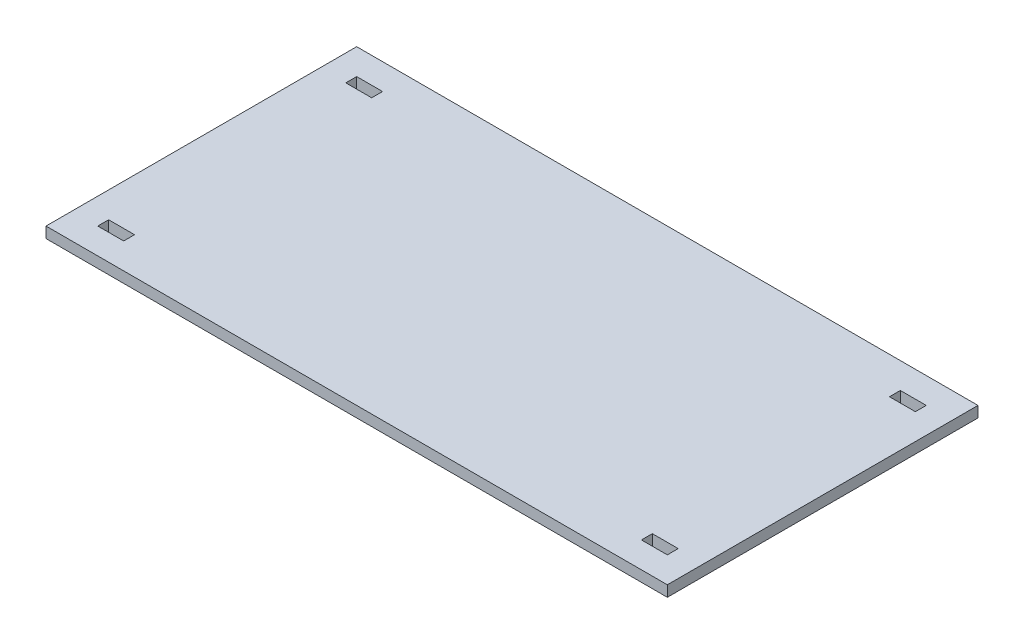
ISO-10303-21;
HEADER;
FILE_DESCRIPTION(('STEP AP214'),'2;1');
FILE_NAME('part.step','',(''),(''),'','','');
FILE_SCHEMA(('AUTOMOTIVE_DESIGN { 1 0 10303 214 1 1 1 1 }'));
ENDSEC;
DATA;
#1=APPLICATION_CONTEXT('core data for automotive mechanical design processes');
#2=APPLICATION_PROTOCOL_DEFINITION('international standard','automotive_design',2000,#1);
#3=PRODUCT_CONTEXT('',#1,'mechanical');
#4=PRODUCT('Part','Part','',(#3));
#5=PRODUCT_RELATED_PRODUCT_CATEGORY('part','',(#4));
#6=PRODUCT_DEFINITION_FORMATION('','',#4);
#7=PRODUCT_DEFINITION_CONTEXT('part definition',#1,'design');
#8=PRODUCT_DEFINITION('design','',#6,#7);
#9=PRODUCT_DEFINITION_SHAPE('','',#8);
#10=(LENGTH_UNIT() NAMED_UNIT(*) SI_UNIT(.MILLI.,.METRE.));
#11=(NAMED_UNIT(*) PLANE_ANGLE_UNIT() SI_UNIT($,.RADIAN.));
#12=(NAMED_UNIT(*) SI_UNIT($,.STERADIAN.) SOLID_ANGLE_UNIT());
#13=UNCERTAINTY_MEASURE_WITH_UNIT(LENGTH_MEASURE(1.E-05),#10,'distance_accuracy_value','');
#14=(GEOMETRIC_REPRESENTATION_CONTEXT(3) GLOBAL_UNCERTAINTY_ASSIGNED_CONTEXT((#13)) GLOBAL_UNIT_ASSIGNED_CONTEXT((#10,
#11,#12)) REPRESENTATION_CONTEXT('',''));
#15=CARTESIAN_POINT('',(0.,0.,0.));
#16=DIRECTION('',(0.,0.,1.));
#17=DIRECTION('',(1.,0.,0.));
#18=AXIS2_PLACEMENT_3D('',#15,#16,#17);
#19=CARTESIAN_POINT('',(-216.154910022963,5.334,-23.7753050079687));
#20=DIRECTION('',(1.,0.,0.));
#21=DIRECTION('',(0.,0.,-1.));
#22=AXIS2_PLACEMENT_3D('',#19,#20,#21);
#23=PLANE('',#22);
#24=DIRECTION('',(0.,0.,1.));
#25=VECTOR('',#24,1.);
#26=CARTESIAN_POINT('',(-216.154910022963,0.,-23.7753050079687));
#27=LINE('',#26,#25);
#28=CARTESIAN_POINT('',(-216.154910022963,0.,-23.7753050079687));
#29=VERTEX_POINT('',#28);
#30=CARTESIAN_POINT('',(-216.154910022963,0.,128.624694992031));
#31=VERTEX_POINT('',#30);
#32=EDGE_CURVE('E298',#29,#31,#27,.T.);
#33=ORIENTED_EDGE('',*,*,#32,.T.);
#34=DIRECTION('',(0.,-1.,0.));
#35=VECTOR('',#34,1.);
#36=CARTESIAN_POINT('',(-216.154910022963,5.334,128.624694992031));
#37=LINE('',#36,#35);
#38=CARTESIAN_POINT('',(-216.154910022963,5.334,128.624694992031));
#39=VERTEX_POINT('',#38);
#40=EDGE_CURVE('E11',#39,#31,#37,.T.);
#41=ORIENTED_EDGE('',*,*,#40,.F.);
#42=DIRECTION('',(0.,0.,1.));
#43=VECTOR('',#42,1.);
#44=CARTESIAN_POINT('',(-216.154910022963,5.334,-23.7753050079687));
#45=LINE('',#44,#43);
#46=CARTESIAN_POINT('',(-216.154910022963,5.334,-23.7753050079687));
#47=VERTEX_POINT('',#46);
#48=EDGE_CURVE('E305',#47,#39,#45,.T.);
#49=ORIENTED_EDGE('',*,*,#48,.F.);
#50=DIRECTION('',(0.,-1.,0.));
#51=VECTOR('',#50,1.);
#52=CARTESIAN_POINT('',(-216.154910022963,5.334,-23.7753050079687));
#53=LINE('',#52,#51);
#54=EDGE_CURVE('E315',#47,#29,#53,.T.);
#55=ORIENTED_EDGE('',*,*,#54,.T.);
#56=EDGE_LOOP('',(#33,#41,#49,#55));
#57=FACE_BOUND('',#56,.T.);
#58=ADVANCED_FACE('F33',(#57),#23,.F.);
#59=CARTESIAN_POINT('',(-216.154910022963,5.334,128.624694992031));
#60=DIRECTION('',(0.,0.,-1.));
#61=DIRECTION('',(-1.,0.,0.));
#62=AXIS2_PLACEMENT_3D('',#59,#60,#61);
#63=PLANE('',#62);
#64=DIRECTION('',(1.,0.,0.));
#65=VECTOR('',#64,1.);
#66=CARTESIAN_POINT('',(-216.154910022963,0.,128.624694992031));
#67=LINE('',#66,#65);
#68=CARTESIAN_POINT('',(88.6450899770369,0.,128.624694992031));
#69=VERTEX_POINT('',#68);
#70=EDGE_CURVE('E318',#31,#69,#67,.T.);
#71=ORIENTED_EDGE('',*,*,#70,.T.);
#72=DIRECTION('',(0.,-1.,0.));
#73=VECTOR('',#72,1.);
#74=CARTESIAN_POINT('',(88.6450899770369,5.334,128.624694992031));
#75=LINE('',#74,#73);
#76=CARTESIAN_POINT('',(88.6450899770369,5.334,128.624694992031));
#77=VERTEX_POINT('',#76);
#78=EDGE_CURVE('E40',#77,#69,#75,.T.);
#79=ORIENTED_EDGE('',*,*,#78,.F.);
#80=DIRECTION('',(1.,0.,0.));
#81=VECTOR('',#80,1.);
#82=CARTESIAN_POINT('',(-216.154910022963,5.334,128.624694992031));
#83=LINE('',#82,#81);
#84=EDGE_CURVE('E308',#39,#77,#83,.T.);
#85=ORIENTED_EDGE('',*,*,#84,.F.);
#86=ORIENTED_EDGE('',*,*,#40,.T.);
#87=EDGE_LOOP('',(#71,#79,#85,#86));
#88=FACE_BOUND('',#87,.T.);
#89=ADVANCED_FACE('F347',(#88),#63,.F.);
#90=CARTESIAN_POINT('',(88.6450899770369,5.334,-23.7753050079687));
#91=DIRECTION('',(-1.,0.,0.));
#92=DIRECTION('',(0.,0.,1.));
#93=AXIS2_PLACEMENT_3D('',#90,#91,#92);
#94=PLANE('',#93);
#95=DIRECTION('',(0.,0.,-1.));
#96=VECTOR('',#95,1.);
#97=CARTESIAN_POINT('',(88.6450899770369,0.,-23.7753050079687));
#98=LINE('',#97,#96);
#99=CARTESIAN_POINT('',(88.6450899770369,0.,-23.7753050079687));
#100=VERTEX_POINT('',#99);
#101=EDGE_CURVE('E320',#69,#100,#98,.T.);
#102=ORIENTED_EDGE('',*,*,#101,.T.);
#103=DIRECTION('',(0.,-1.,0.));
#104=VECTOR('',#103,1.);
#105=CARTESIAN_POINT('',(88.6450899770369,5.334,-23.7753050079687));
#106=LINE('',#105,#104);
#107=CARTESIAN_POINT('',(88.6450899770369,5.334,-23.7753050079687));
#108=VERTEX_POINT('',#107);
#109=EDGE_CURVE('E325',#108,#100,#106,.T.);
#110=ORIENTED_EDGE('',*,*,#109,.F.);
#111=DIRECTION('',(0.,0.,-1.));
#112=VECTOR('',#111,1.);
#113=CARTESIAN_POINT('',(88.6450899770369,5.334,-23.7753050079687));
#114=LINE('',#113,#112);
#115=EDGE_CURVE('E311',#77,#108,#114,.T.);
#116=ORIENTED_EDGE('',*,*,#115,.F.);
#117=ORIENTED_EDGE('',*,*,#78,.T.);
#118=EDGE_LOOP('',(#102,#110,#116,#117));
#119=FACE_BOUND('',#118,.T.);
#120=ADVANCED_FACE('F332',(#119),#94,.F.);
#121=CARTESIAN_POINT('',(-216.154910022963,5.334,-23.7753050079687));
#122=DIRECTION('',(0.,0.,1.));
#123=DIRECTION('',(1.,0.,0.));
#124=AXIS2_PLACEMENT_3D('',#121,#122,#123);
#125=PLANE('',#124);
#126=DIRECTION('',(-1.,0.,0.));
#127=VECTOR('',#126,1.);
#128=CARTESIAN_POINT('',(-216.154910022963,0.,-23.7753050079687));
#129=LINE('',#128,#127);
#130=EDGE_CURVE('E309',#100,#29,#129,.T.);
#131=ORIENTED_EDGE('',*,*,#130,.T.);
#132=ORIENTED_EDGE('',*,*,#54,.F.);
#133=DIRECTION('',(-1.,0.,0.));
#134=VECTOR('',#133,1.);
#135=CARTESIAN_POINT('',(-216.154910022963,5.334,-23.7753050079687));
#136=LINE('',#135,#134);
#137=EDGE_CURVE('E313',#108,#47,#136,.T.);
#138=ORIENTED_EDGE('',*,*,#137,.F.);
#139=ORIENTED_EDGE('',*,*,#109,.T.);
#140=EDGE_LOOP('',(#131,#132,#138,#139));
#141=FACE_BOUND('',#140,.T.);
#142=ADVANCED_FACE('F340',(#141),#125,.F.);
#143=CARTESIAN_POINT('',(0.,5.334,0.));
#144=DIRECTION('',(0.,1.,0.));
#145=DIRECTION('',(0.,0.,1.));
#146=AXIS2_PLACEMENT_3D('',#143,#144,#145);
#147=PLANE('',#146);
#148=DIRECTION('',(-1.,0.,0.));
#149=VECTOR('',#148,1.);
#150=CARTESIAN_POINT('',(-190.754910022963,5.334,110.590694992031));
#151=LINE('',#150,#149);
#152=CARTESIAN_POINT('',(-190.754910022963,5.334,110.590694992031));
#153=VERTEX_POINT('',#152);
#154=CARTESIAN_POINT('',(-203.454910022963,5.334,110.590694992031));
#155=VERTEX_POINT('',#154);
#156=EDGE_CURVE('E47',#153,#155,#151,.T.);
#157=ORIENTED_EDGE('',*,*,#156,.F.);
#158=DIRECTION('',(0.,0.,-1.));
#159=VECTOR('',#158,1.);
#160=CARTESIAN_POINT('',(-190.754910022963,5.334,110.590694992031));
#161=LINE('',#160,#159);
#162=CARTESIAN_POINT('',(-190.754910022963,5.334,115.924694992031));
#163=VERTEX_POINT('',#162);
#164=EDGE_CURVE('E216',#163,#153,#161,.T.);
#165=ORIENTED_EDGE('',*,*,#164,.F.);
#166=DIRECTION('',(1.,0.,0.));
#167=VECTOR('',#166,1.);
#168=CARTESIAN_POINT('',(-190.754910022963,5.334,115.924694992031));
#169=LINE('',#168,#167);
#170=CARTESIAN_POINT('',(-203.454910022963,5.334,115.924694992031));
#171=VERTEX_POINT('',#170);
#172=EDGE_CURVE('E231',#171,#163,#169,.T.);
#173=ORIENTED_EDGE('',*,*,#172,.F.);
#174=DIRECTION('',(0.,0.,1.));
#175=VECTOR('',#174,1.);
#176=CARTESIAN_POINT('',(-203.454910022963,5.334,110.590694992031));
#177=LINE('',#176,#175);
#178=EDGE_CURVE('E227',#155,#171,#177,.T.);
#179=ORIENTED_EDGE('',*,*,#178,.F.);
#180=EDGE_LOOP('',(#157,#165,#173,#179));
#181=FACE_BOUND('',#180,.T.);
#182=DIRECTION('',(1.,0.,0.));
#183=VECTOR('',#182,1.);
#184=CARTESIAN_POINT('',(63.2450899770368,5.334,-5.7413050079687));
#185=LINE('',#184,#183);
#186=CARTESIAN_POINT('',(63.2450899770368,5.334,-5.7413050079687));
#187=VERTEX_POINT('',#186);
#188=CARTESIAN_POINT('',(75.9450899770369,5.334,-5.74130500796871));
#189=VERTEX_POINT('',#188);
#190=EDGE_CURVE('E55',#187,#189,#185,.T.);
#191=ORIENTED_EDGE('',*,*,#190,.F.);
#192=DIRECTION('',(0.,0.,1.));
#193=VECTOR('',#192,1.);
#194=CARTESIAN_POINT('',(63.2450899770368,5.334,-5.7413050079687));
#195=LINE('',#194,#193);
#196=CARTESIAN_POINT('',(63.2450899770369,5.334,-11.0753050079687));
#197=VERTEX_POINT('',#196);
#198=EDGE_CURVE('E248',#197,#187,#195,.T.);
#199=ORIENTED_EDGE('',*,*,#198,.F.);
#200=DIRECTION('',(-1.,0.,0.));
#201=VECTOR('',#200,1.);
#202=CARTESIAN_POINT('',(63.2450899770369,5.334,-11.0753050079687));
#203=LINE('',#202,#201);
#204=CARTESIAN_POINT('',(75.9450899770369,5.334,-11.0753050079687));
#205=VERTEX_POINT('',#204);
#206=EDGE_CURVE('E262',#205,#197,#203,.T.);
#207=ORIENTED_EDGE('',*,*,#206,.F.);
#208=DIRECTION('',(0.,0.,-1.));
#209=VECTOR('',#208,1.);
#210=CARTESIAN_POINT('',(75.9450899770369,5.334,-5.74130500796871));
#211=LINE('',#210,#209);
#212=EDGE_CURVE('E259',#189,#205,#211,.T.);
#213=ORIENTED_EDGE('',*,*,#212,.F.);
#214=EDGE_LOOP('',(#191,#199,#207,#213));
#215=FACE_BOUND('',#214,.T.);
#216=DIRECTION('',(0.,0.,-1.));
#217=VECTOR('',#216,1.);
#218=CARTESIAN_POINT('',(-190.754910022963,5.334,-5.74130500796866));
#219=LINE('',#218,#217);
#220=CARTESIAN_POINT('',(-190.754910022963,5.334,-5.74130500796866));
#221=VERTEX_POINT('',#220);
#222=CARTESIAN_POINT('',(-190.754910022963,5.334,-11.0753050079687));
#223=VERTEX_POINT('',#222);
#224=EDGE_CURVE('E176',#221,#223,#219,.T.);
#225=ORIENTED_EDGE('',*,*,#224,.F.);
#226=DIRECTION('',(1.,0.,0.));
#227=VECTOR('',#226,1.);
#228=CARTESIAN_POINT('',(-190.754910022963,5.334,-5.74130500796866));
#229=LINE('',#228,#227);
#230=CARTESIAN_POINT('',(-203.454910022963,5.334,-5.74130500796868));
#231=VERTEX_POINT('',#230);
#232=EDGE_CURVE('E194',#231,#221,#229,.T.);
#233=ORIENTED_EDGE('',*,*,#232,.F.);
#234=DIRECTION('',(0.,0.,1.));
#235=VECTOR('',#234,1.);
#236=CARTESIAN_POINT('',(-203.454910022963,5.334,-5.74130500796868));
#237=LINE('',#236,#235);
#238=CARTESIAN_POINT('',(-203.454910022963,5.334,-11.0753050079687));
#239=VERTEX_POINT('',#238);
#240=EDGE_CURVE('E197',#239,#231,#237,.T.);
#241=ORIENTED_EDGE('',*,*,#240,.F.);
#242=DIRECTION('',(-1.,0.,0.));
#243=VECTOR('',#242,1.);
#244=CARTESIAN_POINT('',(-190.754910022963,5.334,-11.0753050079687));
#245=LINE('',#244,#243);
#246=EDGE_CURVE('E203',#223,#239,#245,.T.);
#247=ORIENTED_EDGE('',*,*,#246,.F.);
#248=EDGE_LOOP('',(#225,#233,#241,#247));
#249=FACE_BOUND('',#248,.T.);
#250=DIRECTION('',(0.,0.,1.));
#251=VECTOR('',#250,1.);
#252=CARTESIAN_POINT('',(63.2450899770369,5.334,110.590694992031));
#253=LINE('',#252,#251);
#254=CARTESIAN_POINT('',(63.2450899770369,5.334,110.590694992031));
#255=VERTEX_POINT('',#254);
#256=CARTESIAN_POINT('',(63.2450899770369,5.334,115.924694992031));
#257=VERTEX_POINT('',#256);
#258=EDGE_CURVE('E238',#255,#257,#253,.T.);
#259=ORIENTED_EDGE('',*,*,#258,.F.);
#260=DIRECTION('',(-1.,0.,0.));
#261=VECTOR('',#260,1.);
#262=CARTESIAN_POINT('',(63.2450899770369,5.334,110.590694992031));
#263=LINE('',#262,#261);
#264=CARTESIAN_POINT('',(75.9450899770369,5.334,110.590694992031));
#265=VERTEX_POINT('',#264);
#266=EDGE_CURVE('E277',#265,#255,#263,.T.);
#267=ORIENTED_EDGE('',*,*,#266,.F.);
#268=DIRECTION('',(0.,0.,-1.));
#269=VECTOR('',#268,1.);
#270=CARTESIAN_POINT('',(75.9450899770369,5.334,110.590694992031));
#271=LINE('',#270,#269);
#272=CARTESIAN_POINT('',(75.9450899770369,5.334,115.924694992031));
#273=VERTEX_POINT('',#272);
#274=EDGE_CURVE('E291',#273,#265,#271,.T.);
#275=ORIENTED_EDGE('',*,*,#274,.F.);
#276=DIRECTION('',(1.,0.,0.));
#277=VECTOR('',#276,1.);
#278=CARTESIAN_POINT('',(63.2450899770369,5.334,115.924694992031));
#279=LINE('',#278,#277);
#280=EDGE_CURVE('E288',#257,#273,#279,.T.);
#281=ORIENTED_EDGE('',*,*,#280,.F.);
#282=EDGE_LOOP('',(#259,#267,#275,#281));
#283=FACE_BOUND('',#282,.T.);
#284=ORIENTED_EDGE('',*,*,#48,.T.);
#285=ORIENTED_EDGE('',*,*,#84,.T.);
#286=ORIENTED_EDGE('',*,*,#115,.T.);
#287=ORIENTED_EDGE('',*,*,#137,.T.);
#288=EDGE_LOOP('',(#284,#285,#286,#287));
#289=FACE_BOUND('',#288,.T.);
#290=ADVANCED_FACE('F346',(#181,#215,#249,#283,#289),#147,.T.);
#291=CARTESIAN_POINT('',(0.,0.,0.));
#292=DIRECTION('',(0.,1.,0.));
#293=DIRECTION('',(0.,0.,1.));
#294=AXIS2_PLACEMENT_3D('',#291,#292,#293);
#295=PLANE('',#294);
#296=DIRECTION('',(0.,0.,-1.));
#297=VECTOR('',#296,1.);
#298=CARTESIAN_POINT('',(-190.754910022963,0.,110.590694992031));
#299=LINE('',#298,#297);
#300=CARTESIAN_POINT('',(-190.754910022963,0.,115.924694992031));
#301=VERTEX_POINT('',#300);
#302=CARTESIAN_POINT('',(-190.754910022963,0.,110.590694992031));
#303=VERTEX_POINT('',#302);
#304=EDGE_CURVE('E222',#301,#303,#299,.T.);
#305=ORIENTED_EDGE('',*,*,#304,.T.);
#306=DIRECTION('',(-1.,0.,0.));
#307=VECTOR('',#306,1.);
#308=CARTESIAN_POINT('',(-190.754910022963,0.,110.590694992031));
#309=LINE('',#308,#307);
#310=CARTESIAN_POINT('',(-203.454910022963,0.,110.590694992031));
#311=VERTEX_POINT('',#310);
#312=EDGE_CURVE('E212',#303,#311,#309,.T.);
#313=ORIENTED_EDGE('',*,*,#312,.T.);
#314=DIRECTION('',(0.,0.,1.));
#315=VECTOR('',#314,1.);
#316=CARTESIAN_POINT('',(-203.454910022963,0.,110.590694992031));
#317=LINE('',#316,#315);
#318=CARTESIAN_POINT('',(-203.454910022963,0.,115.924694992031));
#319=VERTEX_POINT('',#318);
#320=EDGE_CURVE('E215',#311,#319,#317,.T.);
#321=ORIENTED_EDGE('',*,*,#320,.T.);
#322=DIRECTION('',(1.,0.,0.));
#323=VECTOR('',#322,1.);
#324=CARTESIAN_POINT('',(-190.754910022963,0.,115.924694992031));
#325=LINE('',#324,#323);
#326=EDGE_CURVE('E219',#319,#301,#325,.T.);
#327=ORIENTED_EDGE('',*,*,#326,.T.);
#328=EDGE_LOOP('',(#305,#313,#321,#327));
#329=FACE_BOUND('',#328,.T.);
#330=DIRECTION('',(0.,0.,1.));
#331=VECTOR('',#330,1.);
#332=CARTESIAN_POINT('',(63.2450899770368,0.,-5.7413050079687));
#333=LINE('',#332,#331);
#334=CARTESIAN_POINT('',(63.2450899770369,0.,-11.0753050079687));
#335=VERTEX_POINT('',#334);
#336=CARTESIAN_POINT('',(63.2450899770368,0.,-5.7413050079687));
#337=VERTEX_POINT('',#336);
#338=EDGE_CURVE('E254',#335,#337,#333,.T.);
#339=ORIENTED_EDGE('',*,*,#338,.T.);
#340=DIRECTION('',(1.,0.,0.));
#341=VECTOR('',#340,1.);
#342=CARTESIAN_POINT('',(63.2450899770368,0.,-5.7413050079687));
#343=LINE('',#342,#341);
#344=CARTESIAN_POINT('',(75.9450899770369,0.,-5.74130500796871));
#345=VERTEX_POINT('',#344);
#346=EDGE_CURVE('E244',#337,#345,#343,.T.);
#347=ORIENTED_EDGE('',*,*,#346,.T.);
#348=DIRECTION('',(0.,0.,-1.));
#349=VECTOR('',#348,1.);
#350=CARTESIAN_POINT('',(75.9450899770369,0.,-5.74130500796871));
#351=LINE('',#350,#349);
#352=CARTESIAN_POINT('',(75.9450899770369,0.,-11.0753050079687));
#353=VERTEX_POINT('',#352);
#354=EDGE_CURVE('E247',#345,#353,#351,.T.);
#355=ORIENTED_EDGE('',*,*,#354,.T.);
#356=DIRECTION('',(-1.,0.,0.));
#357=VECTOR('',#356,1.);
#358=CARTESIAN_POINT('',(63.2450899770369,0.,-11.0753050079687));
#359=LINE('',#358,#357);
#360=EDGE_CURVE('E251',#353,#335,#359,.T.);
#361=ORIENTED_EDGE('',*,*,#360,.T.);
#362=EDGE_LOOP('',(#339,#347,#355,#361));
#363=FACE_BOUND('',#362,.T.);
#364=DIRECTION('',(1.,0.,0.));
#365=VECTOR('',#364,1.);
#366=CARTESIAN_POINT('',(-190.754910022963,0.,-5.74130500796866));
#367=LINE('',#366,#365);
#368=CARTESIAN_POINT('',(-203.454910022963,0.,-5.74130500796868));
#369=VERTEX_POINT('',#368);
#370=CARTESIAN_POINT('',(-190.754910022963,0.,-5.74130500796866));
#371=VERTEX_POINT('',#370);
#372=EDGE_CURVE('E181',#369,#371,#367,.T.);
#373=ORIENTED_EDGE('',*,*,#372,.T.);
#374=DIRECTION('',(0.,0.,-1.));
#375=VECTOR('',#374,1.);
#376=CARTESIAN_POINT('',(-190.754910022963,0.,-5.74130500796866));
#377=LINE('',#376,#375);
#378=CARTESIAN_POINT('',(-190.754910022963,0.,-11.0753050079687));
#379=VERTEX_POINT('',#378);
#380=EDGE_CURVE('E173',#371,#379,#377,.T.);
#381=ORIENTED_EDGE('',*,*,#380,.T.);
#382=DIRECTION('',(-1.,0.,0.));
#383=VECTOR('',#382,1.);
#384=CARTESIAN_POINT('',(-190.754910022963,0.,-11.0753050079687));
#385=LINE('',#384,#383);
#386=CARTESIAN_POINT('',(-203.454910022963,0.,-11.0753050079687));
#387=VERTEX_POINT('',#386);
#388=EDGE_CURVE('E185',#379,#387,#385,.T.);
#389=ORIENTED_EDGE('',*,*,#388,.T.);
#390=DIRECTION('',(0.,0.,1.));
#391=VECTOR('',#390,1.);
#392=CARTESIAN_POINT('',(-203.454910022963,0.,-5.74130500796868));
#393=LINE('',#392,#391);
#394=EDGE_CURVE('E189',#387,#369,#393,.T.);
#395=ORIENTED_EDGE('',*,*,#394,.T.);
#396=EDGE_LOOP('',(#373,#381,#389,#395));
#397=FACE_BOUND('',#396,.T.);
#398=DIRECTION('',(-1.,0.,0.));
#399=VECTOR('',#398,1.);
#400=CARTESIAN_POINT('',(63.2450899770369,0.,110.590694992031));
#401=LINE('',#400,#399);
#402=CARTESIAN_POINT('',(75.9450899770369,0.,110.590694992031));
#403=VERTEX_POINT('',#402);
#404=CARTESIAN_POINT('',(63.2450899770369,0.,110.590694992031));
#405=VERTEX_POINT('',#404);
#406=EDGE_CURVE('E283',#403,#405,#401,.T.);
#407=ORIENTED_EDGE('',*,*,#406,.T.);
#408=DIRECTION('',(0.,0.,1.));
#409=VECTOR('',#408,1.);
#410=CARTESIAN_POINT('',(63.2450899770369,0.,110.590694992031));
#411=LINE('',#410,#409);
#412=CARTESIAN_POINT('',(63.2450899770369,0.,115.924694992031));
#413=VERTEX_POINT('',#412);
#414=EDGE_CURVE('E273',#405,#413,#411,.T.);
#415=ORIENTED_EDGE('',*,*,#414,.T.);
#416=DIRECTION('',(1.,0.,0.));
#417=VECTOR('',#416,1.);
#418=CARTESIAN_POINT('',(63.2450899770369,0.,115.924694992031));
#419=LINE('',#418,#417);
#420=CARTESIAN_POINT('',(75.9450899770369,0.,115.924694992031));
#421=VERTEX_POINT('',#420);
#422=EDGE_CURVE('E276',#413,#421,#419,.T.);
#423=ORIENTED_EDGE('',*,*,#422,.T.);
#424=DIRECTION('',(0.,0.,-1.));
#425=VECTOR('',#424,1.);
#426=CARTESIAN_POINT('',(75.9450899770369,0.,110.590694992031));
#427=LINE('',#426,#425);
#428=EDGE_CURVE('E280',#421,#403,#427,.T.);
#429=ORIENTED_EDGE('',*,*,#428,.T.);
#430=EDGE_LOOP('',(#407,#415,#423,#429));
#431=FACE_BOUND('',#430,.T.);
#432=ORIENTED_EDGE('',*,*,#32,.F.);
#433=ORIENTED_EDGE('',*,*,#130,.F.);
#434=ORIENTED_EDGE('',*,*,#101,.F.);
#435=ORIENTED_EDGE('',*,*,#70,.F.);
#436=EDGE_LOOP('',(#432,#433,#434,#435));
#437=FACE_BOUND('',#436,.T.);
#438=ADVANCED_FACE('F191',(#329,#363,#397,#431,#437),#295,.F.);
#439=CARTESIAN_POINT('',(63.2450899770369,0.,110.590694992031));
#440=DIRECTION('',(-1.,0.,0.));
#441=DIRECTION('',(0.,0.,1.));
#442=AXIS2_PLACEMENT_3D('',#439,#440,#441);
#443=PLANE('',#442);
#444=ORIENTED_EDGE('',*,*,#258,.T.);
#445=DIRECTION('',(0.,1.,0.));
#446=VECTOR('',#445,1.);
#447=CARTESIAN_POINT('',(63.2450899770369,0.,115.924694992031));
#448=LINE('',#447,#446);
#449=EDGE_CURVE('E286',#413,#257,#448,.T.);
#450=ORIENTED_EDGE('',*,*,#449,.F.);
#451=ORIENTED_EDGE('',*,*,#414,.F.);
#452=DIRECTION('',(0.,1.,0.));
#453=VECTOR('',#452,1.);
#454=CARTESIAN_POINT('',(63.2450899770369,0.,110.590694992031));
#455=LINE('',#454,#453);
#456=EDGE_CURVE('E296',#405,#255,#455,.T.);
#457=ORIENTED_EDGE('',*,*,#456,.T.);
#458=EDGE_LOOP('',(#444,#450,#451,#457));
#459=FACE_BOUND('',#458,.T.);
#460=ADVANCED_FACE('F359',(#459),#443,.F.);
#461=CARTESIAN_POINT('',(63.2450899770369,0.,110.590694992031));
#462=DIRECTION('',(0.,0.,-1.));
#463=DIRECTION('',(-1.,0.,0.));
#464=AXIS2_PLACEMENT_3D('',#461,#462,#463);
#465=PLANE('',#464);
#466=ORIENTED_EDGE('',*,*,#266,.T.);
#467=ORIENTED_EDGE('',*,*,#456,.F.);
#468=ORIENTED_EDGE('',*,*,#406,.F.);
#469=DIRECTION('',(0.,1.,0.));
#470=VECTOR('',#469,1.);
#471=CARTESIAN_POINT('',(75.9450899770369,0.,110.590694992031));
#472=LINE('',#471,#470);
#473=EDGE_CURVE('E299',#403,#265,#472,.T.);
#474=ORIENTED_EDGE('',*,*,#473,.T.);
#475=EDGE_LOOP('',(#466,#467,#468,#474));
#476=FACE_BOUND('',#475,.T.);
#477=ADVANCED_FACE('F366',(#476),#465,.F.);
#478=CARTESIAN_POINT('',(75.9450899770369,0.,110.590694992031));
#479=DIRECTION('',(1.,0.,0.));
#480=DIRECTION('',(0.,0.,-1.));
#481=AXIS2_PLACEMENT_3D('',#478,#479,#480);
#482=PLANE('',#481);
#483=ORIENTED_EDGE('',*,*,#274,.T.);
#484=ORIENTED_EDGE('',*,*,#473,.F.);
#485=ORIENTED_EDGE('',*,*,#428,.F.);
#486=DIRECTION('',(0.,1.,0.));
#487=VECTOR('',#486,1.);
#488=CARTESIAN_POINT('',(75.9450899770369,0.,115.924694992031));
#489=LINE('',#488,#487);
#490=EDGE_CURVE('E301',#421,#273,#489,.T.);
#491=ORIENTED_EDGE('',*,*,#490,.T.);
#492=EDGE_LOOP('',(#483,#484,#485,#491));
#493=FACE_BOUND('',#492,.T.);
#494=ADVANCED_FACE('F371',(#493),#482,.F.);
#495=CARTESIAN_POINT('',(63.2450899770369,0.,115.924694992031));
#496=DIRECTION('',(0.,0.,1.));
#497=DIRECTION('',(1.,0.,0.));
#498=AXIS2_PLACEMENT_3D('',#495,#496,#497);
#499=PLANE('',#498);
#500=ORIENTED_EDGE('',*,*,#280,.T.);
#501=ORIENTED_EDGE('',*,*,#490,.F.);
#502=ORIENTED_EDGE('',*,*,#422,.F.);
#503=ORIENTED_EDGE('',*,*,#449,.T.);
#504=EDGE_LOOP('',(#500,#501,#502,#503));
#505=FACE_BOUND('',#504,.T.);
#506=ADVANCED_FACE('F368',(#505),#499,.F.);
#507=CARTESIAN_POINT('',(-190.754910022963,0.,-5.74130500796866));
#508=DIRECTION('',(1.,0.,0.));
#509=DIRECTION('',(0.,0.,-1.));
#510=AXIS2_PLACEMENT_3D('',#507,#508,#509);
#511=PLANE('',#510);
#512=ORIENTED_EDGE('',*,*,#224,.T.);
#513=DIRECTION('',(0.,1.,0.));
#514=VECTOR('',#513,1.);
#515=CARTESIAN_POINT('',(-190.754910022963,0.,-11.0753050079687));
#516=LINE('',#515,#514);
#517=EDGE_CURVE('E169',#379,#223,#516,.T.);
#518=ORIENTED_EDGE('',*,*,#517,.F.);
#519=ORIENTED_EDGE('',*,*,#380,.F.);
#520=DIRECTION('',(0.,1.,0.));
#521=VECTOR('',#520,1.);
#522=CARTESIAN_POINT('',(-190.754910022963,0.,-5.74130500796866));
#523=LINE('',#522,#521);
#524=EDGE_CURVE('E207',#371,#221,#523,.T.);
#525=ORIENTED_EDGE('',*,*,#524,.T.);
#526=EDGE_LOOP('',(#512,#518,#519,#525));
#527=FACE_BOUND('',#526,.T.);
#528=ADVANCED_FACE('F171',(#527),#511,.F.);
#529=CARTESIAN_POINT('',(-190.754910022963,0.,-5.74130500796866));
#530=DIRECTION('',(0.,0.,1.));
#531=DIRECTION('',(1.,0.,0.));
#532=AXIS2_PLACEMENT_3D('',#529,#530,#531);
#533=PLANE('',#532);
#534=ORIENTED_EDGE('',*,*,#232,.T.);
#535=ORIENTED_EDGE('',*,*,#524,.F.);
#536=ORIENTED_EDGE('',*,*,#372,.F.);
#537=DIRECTION('',(0.,1.,0.));
#538=VECTOR('',#537,1.);
#539=CARTESIAN_POINT('',(-203.454910022963,0.,-5.74130500796868));
#540=LINE('',#539,#538);
#541=EDGE_CURVE('E209',#369,#231,#540,.T.);
#542=ORIENTED_EDGE('',*,*,#541,.T.);
#543=EDGE_LOOP('',(#534,#535,#536,#542));
#544=FACE_BOUND('',#543,.T.);
#545=ADVANCED_FACE('F411',(#544),#533,.F.);
#546=CARTESIAN_POINT('',(-203.454910022963,0.,-5.74130500796868));
#547=DIRECTION('',(-1.,0.,0.));
#548=DIRECTION('',(0.,0.,1.));
#549=AXIS2_PLACEMENT_3D('',#546,#547,#548);
#550=PLANE('',#549);
#551=ORIENTED_EDGE('',*,*,#240,.T.);
#552=ORIENTED_EDGE('',*,*,#541,.F.);
#553=ORIENTED_EDGE('',*,*,#394,.F.);
#554=DIRECTION('',(0.,1.,0.));
#555=VECTOR('',#554,1.);
#556=CARTESIAN_POINT('',(-203.454910022963,0.,-11.0753050079687));
#557=LINE('',#556,#555);
#558=EDGE_CURVE('E180',#387,#239,#557,.T.);
#559=ORIENTED_EDGE('',*,*,#558,.T.);
#560=EDGE_LOOP('',(#551,#552,#553,#559));
#561=FACE_BOUND('',#560,.T.);
#562=ADVANCED_FACE('F414',(#561),#550,.F.);
#563=CARTESIAN_POINT('',(-190.754910022963,0.,-11.0753050079687));
#564=DIRECTION('',(0.,0.,-1.));
#565=DIRECTION('',(-1.,0.,0.));
#566=AXIS2_PLACEMENT_3D('',#563,#564,#565);
#567=PLANE('',#566);
#568=ORIENTED_EDGE('',*,*,#246,.T.);
#569=ORIENTED_EDGE('',*,*,#558,.F.);
#570=ORIENTED_EDGE('',*,*,#388,.F.);
#571=ORIENTED_EDGE('',*,*,#517,.T.);
#572=EDGE_LOOP('',(#568,#569,#570,#571));
#573=FACE_BOUND('',#572,.T.);
#574=ADVANCED_FACE('F186',(#573),#567,.F.);
#575=CARTESIAN_POINT('',(63.2450899770368,0.,-5.7413050079687));
#576=DIRECTION('',(0.,0.,1.));
#577=DIRECTION('',(1.,0.,0.));
#578=AXIS2_PLACEMENT_3D('',#575,#576,#577);
#579=PLANE('',#578);
#580=ORIENTED_EDGE('',*,*,#190,.T.);
#581=DIRECTION('',(0.,1.,0.));
#582=VECTOR('',#581,1.);
#583=CARTESIAN_POINT('',(75.9450899770369,0.,-5.74130500796871));
#584=LINE('',#583,#582);
#585=EDGE_CURVE('E257',#345,#189,#584,.T.);
#586=ORIENTED_EDGE('',*,*,#585,.F.);
#587=ORIENTED_EDGE('',*,*,#346,.F.);
#588=DIRECTION('',(0.,1.,0.));
#589=VECTOR('',#588,1.);
#590=CARTESIAN_POINT('',(63.2450899770368,0.,-5.7413050079687));
#591=LINE('',#590,#589);
#592=EDGE_CURVE('E228',#337,#187,#591,.T.);
#593=ORIENTED_EDGE('',*,*,#592,.T.);
#594=EDGE_LOOP('',(#580,#586,#587,#593));
#595=FACE_BOUND('',#594,.T.);
#596=ADVANCED_FACE('F379',(#595),#579,.F.);
#597=CARTESIAN_POINT('',(63.2450899770368,0.,-5.7413050079687));
#598=DIRECTION('',(-1.,0.,0.));
#599=DIRECTION('',(0.,0.,1.));
#600=AXIS2_PLACEMENT_3D('',#597,#598,#599);
#601=PLANE('',#600);
#602=ORIENTED_EDGE('',*,*,#198,.T.);
#603=ORIENTED_EDGE('',*,*,#592,.F.);
#604=ORIENTED_EDGE('',*,*,#338,.F.);
#605=DIRECTION('',(0.,1.,0.));
#606=VECTOR('',#605,1.);
#607=CARTESIAN_POINT('',(63.2450899770369,0.,-11.0753050079687));
#608=LINE('',#607,#606);
#609=EDGE_CURVE('E268',#335,#197,#608,.T.);
#610=ORIENTED_EDGE('',*,*,#609,.T.);
#611=EDGE_LOOP('',(#602,#603,#604,#610));
#612=FACE_BOUND('',#611,.T.);
#613=ADVANCED_FACE('F382',(#612),#601,.F.);
#614=CARTESIAN_POINT('',(63.2450899770369,0.,-11.0753050079687));
#615=DIRECTION('',(0.,0.,-1.));
#616=DIRECTION('',(-1.,0.,0.));
#617=AXIS2_PLACEMENT_3D('',#614,#615,#616);
#618=PLANE('',#617);
#619=ORIENTED_EDGE('',*,*,#206,.T.);
#620=ORIENTED_EDGE('',*,*,#609,.F.);
#621=ORIENTED_EDGE('',*,*,#360,.F.);
#622=DIRECTION('',(0.,1.,0.));
#623=VECTOR('',#622,1.);
#624=CARTESIAN_POINT('',(75.9450899770369,0.,-11.0753050079687));
#625=LINE('',#624,#623);
#626=EDGE_CURVE('E270',#353,#205,#625,.T.);
#627=ORIENTED_EDGE('',*,*,#626,.T.);
#628=EDGE_LOOP('',(#619,#620,#621,#627));
#629=FACE_BOUND('',#628,.T.);
#630=ADVANCED_FACE('F387',(#629),#618,.F.);
#631=CARTESIAN_POINT('',(75.9450899770369,0.,-5.74130500796871));
#632=DIRECTION('',(1.,0.,0.));
#633=DIRECTION('',(0.,0.,-1.));
#634=AXIS2_PLACEMENT_3D('',#631,#632,#633);
#635=PLANE('',#634);
#636=ORIENTED_EDGE('',*,*,#212,.T.);
#637=ORIENTED_EDGE('',*,*,#626,.F.);
#638=ORIENTED_EDGE('',*,*,#354,.F.);
#639=ORIENTED_EDGE('',*,*,#585,.T.);
#640=EDGE_LOOP('',(#636,#637,#638,#639));
#641=FACE_BOUND('',#640,.T.);
#642=ADVANCED_FACE('F383',(#641),#635,.F.);
#643=CARTESIAN_POINT('',(-190.754910022963,0.,110.590694992031));
#644=DIRECTION('',(0.,0.,-1.));
#645=DIRECTION('',(-1.,0.,0.));
#646=AXIS2_PLACEMENT_3D('',#643,#644,#645);
#647=PLANE('',#646);
#648=ORIENTED_EDGE('',*,*,#156,.T.);
#649=DIRECTION('',(0.,1.,0.));
#650=VECTOR('',#649,1.);
#651=CARTESIAN_POINT('',(-203.454910022963,0.,110.590694992031));
#652=LINE('',#651,#650);
#653=EDGE_CURVE('E225',#311,#155,#652,.T.);
#654=ORIENTED_EDGE('',*,*,#653,.F.);
#655=ORIENTED_EDGE('',*,*,#312,.F.);
#656=DIRECTION('',(0.,1.,0.));
#657=VECTOR('',#656,1.);
#658=CARTESIAN_POINT('',(-190.754910022963,0.,110.590694992031));
#659=LINE('',#658,#657);
#660=EDGE_CURVE('E236',#303,#153,#659,.T.);
#661=ORIENTED_EDGE('',*,*,#660,.T.);
#662=EDGE_LOOP('',(#648,#654,#655,#661));
#663=FACE_BOUND('',#662,.T.);
#664=ADVANCED_FACE('F386',(#663),#647,.F.);
#665=CARTESIAN_POINT('',(-190.754910022963,0.,110.590694992031));
#666=DIRECTION('',(1.,0.,0.));
#667=DIRECTION('',(0.,0.,-1.));
#668=AXIS2_PLACEMENT_3D('',#665,#666,#667);
#669=PLANE('',#668);
#670=ORIENTED_EDGE('',*,*,#164,.T.);
#671=ORIENTED_EDGE('',*,*,#660,.F.);
#672=ORIENTED_EDGE('',*,*,#304,.F.);
#673=DIRECTION('',(0.,1.,0.));
#674=VECTOR('',#673,1.);
#675=CARTESIAN_POINT('',(-190.754910022963,0.,115.924694992031));
#676=LINE('',#675,#674);
#677=EDGE_CURVE('E239',#301,#163,#676,.T.);
#678=ORIENTED_EDGE('',*,*,#677,.T.);
#679=EDGE_LOOP('',(#670,#671,#672,#678));
#680=FACE_BOUND('',#679,.T.);
#681=ADVANCED_FACE('F397',(#680),#669,.F.);
#682=CARTESIAN_POINT('',(-190.754910022963,0.,115.924694992031));
#683=DIRECTION('',(0.,0.,1.));
#684=DIRECTION('',(1.,0.,0.));
#685=AXIS2_PLACEMENT_3D('',#682,#683,#684);
#686=PLANE('',#685);
#687=ORIENTED_EDGE('',*,*,#172,.T.);
#688=ORIENTED_EDGE('',*,*,#677,.F.);
#689=ORIENTED_EDGE('',*,*,#326,.F.);
#690=DIRECTION('',(0.,1.,0.));
#691=VECTOR('',#690,1.);
#692=CARTESIAN_POINT('',(-203.454910022963,0.,115.924694992031));
#693=LINE('',#692,#691);
#694=EDGE_CURVE('E241',#319,#171,#693,.T.);
#695=ORIENTED_EDGE('',*,*,#694,.T.);
#696=EDGE_LOOP('',(#687,#688,#689,#695));
#697=FACE_BOUND('',#696,.T.);
#698=ADVANCED_FACE('F401',(#697),#686,.F.);
#699=CARTESIAN_POINT('',(-203.454910022963,0.,110.590694992031));
#700=DIRECTION('',(-1.,0.,0.));
#701=DIRECTION('',(0.,0.,1.));
#702=AXIS2_PLACEMENT_3D('',#699,#700,#701);
#703=PLANE('',#702);
#704=ORIENTED_EDGE('',*,*,#178,.T.);
#705=ORIENTED_EDGE('',*,*,#694,.F.);
#706=ORIENTED_EDGE('',*,*,#320,.F.);
#707=ORIENTED_EDGE('',*,*,#653,.T.);
#708=EDGE_LOOP('',(#704,#705,#706,#707));
#709=FACE_BOUND('',#708,.T.);
#710=ADVANCED_FACE('F398',(#709),#703,.F.);
#711=CLOSED_SHELL('',(#58,#89,#120,#142,#290,#438,#460,#477,#494,#506,#528,#545,#562,#574,#596,
#613,#630,#642,#664,#681,#698,#710));
#712=MANIFOLD_SOLID_BREP('B2',#711);
#713=ADVANCED_BREP_SHAPE_REPRESENTATION('',(#18,#712),#14);
#714=SHAPE_DEFINITION_REPRESENTATION(#9,#713);
ENDSEC;
END-ISO-10303-21;
